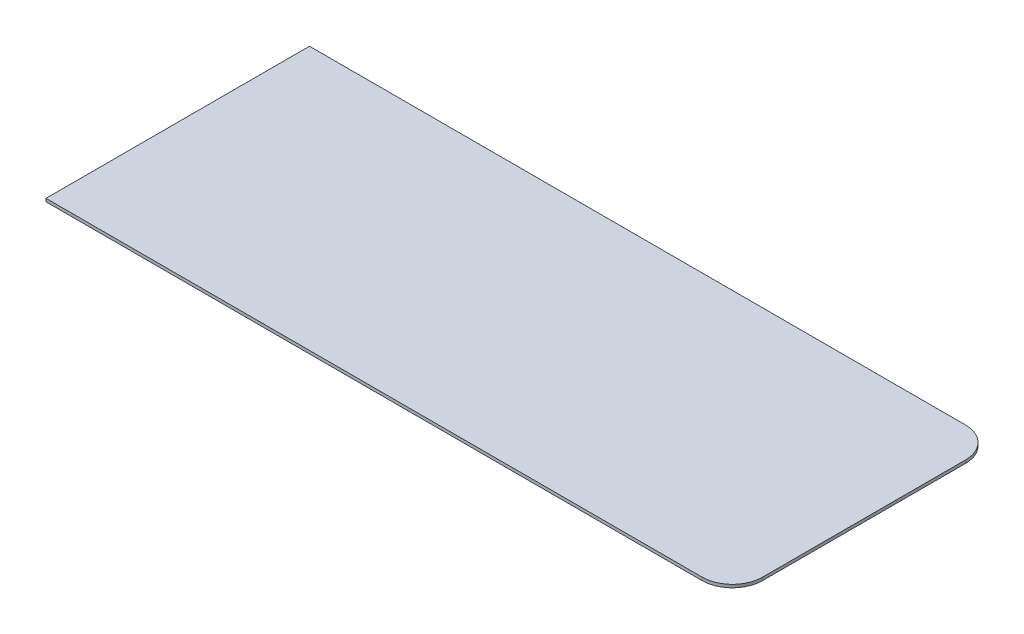
ISO-10303-21;
HEADER;
FILE_DESCRIPTION(('STEP AP214'),'2;1');
FILE_NAME('part.step','',(''),(''),'','','');
FILE_SCHEMA(('AUTOMOTIVE_DESIGN { 1 0 10303 214 1 1 1 1 }'));
ENDSEC;
DATA;
#1=APPLICATION_CONTEXT('core data for automotive mechanical design processes');
#2=APPLICATION_PROTOCOL_DEFINITION('international standard','automotive_design',2000,#1);
#3=PRODUCT_CONTEXT('',#1,'mechanical');
#4=PRODUCT('Part','Part','',(#3));
#5=PRODUCT_RELATED_PRODUCT_CATEGORY('part','',(#4));
#6=PRODUCT_DEFINITION_FORMATION('','',#4);
#7=PRODUCT_DEFINITION_CONTEXT('part definition',#1,'design');
#8=PRODUCT_DEFINITION('design','',#6,#7);
#9=PRODUCT_DEFINITION_SHAPE('','',#8);
#10=(LENGTH_UNIT() NAMED_UNIT(*) SI_UNIT(.MILLI.,.METRE.));
#11=(NAMED_UNIT(*) PLANE_ANGLE_UNIT() SI_UNIT($,.RADIAN.));
#12=(NAMED_UNIT(*) SI_UNIT($,.STERADIAN.) SOLID_ANGLE_UNIT());
#13=UNCERTAINTY_MEASURE_WITH_UNIT(LENGTH_MEASURE(1.E-05),#10,'distance_accuracy_value','');
#14=(GEOMETRIC_REPRESENTATION_CONTEXT(3) GLOBAL_UNCERTAINTY_ASSIGNED_CONTEXT((#13)) GLOBAL_UNIT_ASSIGNED_CONTEXT((#10,
#11,#12)) REPRESENTATION_CONTEXT('',''));
#15=CARTESIAN_POINT('',(0.,0.,0.));
#16=DIRECTION('',(0.,0.,1.));
#17=DIRECTION('',(1.,0.,0.));
#18=AXIS2_PLACEMENT_3D('',#15,#16,#17);
#19=CARTESIAN_POINT('',(2.36062020262803,0.,87.));
#20=DIRECTION('',(0.,0.,1.));
#21=DIRECTION('',(0.,1.,0.));
#22=AXIS2_PLACEMENT_3D('',#19,#20,#21);
#23=PLANE('',#22);
#24=DIRECTION('',(1.,0.,0.));
#25=VECTOR('',#24,1.);
#26=CARTESIAN_POINT('',(2.36062020262803,0.,87.));
#27=LINE('',#26,#25);
#28=CARTESIAN_POINT('',(-26.639379797372,-1.72956678816234E-13,87.));
#29=VERTEX_POINT('',#28);
#30=CARTESIAN_POINT('',(190.,0.,87.));
#31=VERTEX_POINT('',#30);
#32=EDGE_CURVE('E177',#29,#31,#27,.T.);
#33=ORIENTED_EDGE('',*,*,#32,.T.);
#34=DIRECTION('',(0.,-1.,0.));
#35=VECTOR('',#34,1.);
#36=CARTESIAN_POINT('',(190.,1.,87.));
#37=LINE('',#36,#35);
#38=CARTESIAN_POINT('',(190.,1.,87.));
#39=VERTEX_POINT('',#38);
#40=EDGE_CURVE('E153',#31,#39,#37,.F.);
#41=ORIENTED_EDGE('',*,*,#40,.T.);
#42=DIRECTION('',(-1.,0.,0.));
#43=VECTOR('',#42,1.);
#44=CARTESIAN_POINT('',(3.36062020262803,1.00000000000004,87.));
#45=LINE('',#44,#43);
#46=CARTESIAN_POINT('',(-26.639379797372,0.999999999999827,87.));
#47=VERTEX_POINT('',#46);
#48=EDGE_CURVE('E134',#47,#39,#45,.F.);
#49=ORIENTED_EDGE('',*,*,#48,.F.);
#50=DIRECTION('',(0.,1.,0.));
#51=VECTOR('',#50,1.);
#52=CARTESIAN_POINT('',(-26.639379797372,-1.72962440858082E-13,87.));
#53=LINE('',#52,#51);
#54=EDGE_CURVE('E13',#29,#47,#53,.T.);
#55=ORIENTED_EDGE('',*,*,#54,.F.);
#56=EDGE_LOOP('',(#33,#41,#49,#55));
#57=FACE_BOUND('',#56,.T.);
#58=ADVANCED_FACE('F63',(#57),#23,.T.);
#59=CARTESIAN_POINT('',(-26.639379797372,-1.68495527907442E-13,0.));
#60=DIRECTION('',(0.,0.,-1.));
#61=DIRECTION('',(0.,-1.,0.));
#62=AXIS2_PLACEMENT_3D('',#59,#60,#61);
#63=PLANE('',#62);
#64=DIRECTION('',(1.,0.,0.));
#65=VECTOR('',#64,1.);
#66=CARTESIAN_POINT('',(3.36062020262801,1.00000000000004,0.));
#67=LINE('',#66,#65);
#68=CARTESIAN_POINT('',(190.,1.,0.));
#69=VERTEX_POINT('',#68);
#70=CARTESIAN_POINT('',(-26.639379797372,0.999999999999832,0.));
#71=VERTEX_POINT('',#70);
#72=EDGE_CURVE('E67',#69,#71,#67,.F.);
#73=ORIENTED_EDGE('',*,*,#72,.F.);
#74=DIRECTION('',(0.,-1.,0.));
#75=VECTOR('',#74,1.);
#76=CARTESIAN_POINT('',(190.,1.,0.));
#77=LINE('',#76,#75);
#78=CARTESIAN_POINT('',(190.,0.,0.));
#79=VERTEX_POINT('',#78);
#80=EDGE_CURVE('E140',#69,#79,#77,.T.);
#81=ORIENTED_EDGE('',*,*,#80,.T.);
#82=DIRECTION('',(-1.,0.,0.));
#83=VECTOR('',#82,1.);
#84=CARTESIAN_POINT('',(-26.639379797372,-1.68495527907442E-13,0.));
#85=LINE('',#84,#83);
#86=CARTESIAN_POINT('',(-26.639379797372,-1.68510150838554E-13,0.));
#87=VERTEX_POINT('',#86);
#88=EDGE_CURVE('E127',#79,#87,#85,.T.);
#89=ORIENTED_EDGE('',*,*,#88,.T.);
#90=DIRECTION('',(0.,1.,0.));
#91=VECTOR('',#90,1.);
#92=CARTESIAN_POINT('',(-26.639379797372,-1.68495527907442E-13,0.));
#93=LINE('',#92,#91);
#94=EDGE_CURVE('E74',#87,#71,#93,.T.);
#95=ORIENTED_EDGE('',*,*,#94,.T.);
#96=EDGE_LOOP('',(#73,#81,#89,#95));
#97=FACE_BOUND('',#96,.T.);
#98=ADVANCED_FACE('F144',(#97),#63,.T.);
#99=CARTESIAN_POINT('',(0.,0.,0.));
#100=DIRECTION('',(0.,1.,0.));
#101=DIRECTION('',(0.,0.,1.));
#102=AXIS2_PLACEMENT_3D('',#99,#100,#101);
#103=PLANE('',#102);
#104=ORIENTED_EDGE('',*,*,#88,.F.);
#105=CARTESIAN_POINT('',(190.,0.,10.));
#106=DIRECTION('',(0.,1.,0.));
#107=DIRECTION('',(0.,0.,1.));
#108=AXIS2_PLACEMENT_3D('',#105,#106,#107);
#109=CIRCLE('',#108,10.);
#110=CARTESIAN_POINT('',(200.,0.,10.));
#111=VERTEX_POINT('',#110);
#112=EDGE_CURVE('E105',#79,#111,#109,.F.);
#113=ORIENTED_EDGE('',*,*,#112,.T.);
#114=DIRECTION('',(0.,0.,-1.));
#115=VECTOR('',#114,1.);
#116=CARTESIAN_POINT('',(200.,0.,0.));
#117=LINE('',#116,#115);
#118=CARTESIAN_POINT('',(200.,0.,77.));
#119=VERTEX_POINT('',#118);
#120=EDGE_CURVE('E168',#119,#111,#117,.T.);
#121=ORIENTED_EDGE('',*,*,#120,.F.);
#122=CARTESIAN_POINT('',(190.,0.,77.));
#123=DIRECTION('',(0.,1.,0.));
#124=DIRECTION('',(0.,0.,1.));
#125=AXIS2_PLACEMENT_3D('',#122,#123,#124);
#126=CIRCLE('',#125,10.);
#127=EDGE_CURVE('E142',#119,#31,#126,.F.);
#128=ORIENTED_EDGE('',*,*,#127,.T.);
#129=ORIENTED_EDGE('',*,*,#32,.F.);
#130=DIRECTION('',(0.,0.,1.));
#131=VECTOR('',#130,1.);
#132=CARTESIAN_POINT('',(-26.639379797372,-1.72962440858082E-13,87.));
#133=LINE('',#132,#131);
#134=EDGE_CURVE('E129',#87,#29,#133,.T.);
#135=ORIENTED_EDGE('',*,*,#134,.F.);
#136=EDGE_LOOP('',(#104,#113,#121,#128,#129,#135));
#137=FACE_BOUND('',#136,.T.);
#138=ADVANCED_FACE('F65',(#137),#103,.F.);
#139=CARTESIAN_POINT('',(3.36062020262801,1.00000000000004,0.));
#140=DIRECTION('',(0.,-1.,0.));
#141=DIRECTION('',(1.,0.,0.));
#142=AXIS2_PLACEMENT_3D('',#139,#140,#141);
#143=PLANE('',#142);
#144=ORIENTED_EDGE('',*,*,#48,.T.);
#145=CARTESIAN_POINT('',(190.,1.,77.));
#146=DIRECTION('',(0.,1.,0.));
#147=DIRECTION('',(0.,0.,1.));
#148=AXIS2_PLACEMENT_3D('',#145,#146,#147);
#149=CIRCLE('',#148,10.);
#150=CARTESIAN_POINT('',(200.,1.,77.));
#151=VERTEX_POINT('',#150);
#152=EDGE_CURVE('E163',#39,#151,#149,.T.);
#153=ORIENTED_EDGE('',*,*,#152,.T.);
#154=DIRECTION('',(0.,0.,-1.));
#155=VECTOR('',#154,1.);
#156=CARTESIAN_POINT('',(200.,1.,0.));
#157=LINE('',#156,#155);
#158=CARTESIAN_POINT('',(200.,1.,10.));
#159=VERTEX_POINT('',#158);
#160=EDGE_CURVE('E160',#151,#159,#157,.T.);
#161=ORIENTED_EDGE('',*,*,#160,.T.);
#162=CARTESIAN_POINT('',(190.,1.,10.));
#163=DIRECTION('',(0.,1.,0.));
#164=DIRECTION('',(0.,0.,1.));
#165=AXIS2_PLACEMENT_3D('',#162,#163,#164);
#166=CIRCLE('',#165,10.);
#167=EDGE_CURVE('E157',#159,#69,#166,.T.);
#168=ORIENTED_EDGE('',*,*,#167,.T.);
#169=ORIENTED_EDGE('',*,*,#72,.T.);
#170=DIRECTION('',(0.,0.,-1.));
#171=VECTOR('',#170,1.);
#172=CARTESIAN_POINT('',(-26.639379797372,0.999999999999832,0.));
#173=LINE('',#172,#171);
#174=EDGE_CURVE('E148',#71,#47,#173,.F.);
#175=ORIENTED_EDGE('',*,*,#174,.T.);
#176=EDGE_LOOP('',(#144,#153,#161,#168,#169,#175));
#177=FACE_BOUND('',#176,.T.);
#178=ADVANCED_FACE('F184',(#177),#143,.F.);
#179=CARTESIAN_POINT('',(-26.639379797372,-1.72962440858082E-13,87.));
#180=DIRECTION('',(-1.,0.,0.));
#181=DIRECTION('',(0.,-1.,0.));
#182=AXIS2_PLACEMENT_3D('',#179,#180,#181);
#183=PLANE('',#182);
#184=ORIENTED_EDGE('',*,*,#174,.F.);
#185=ORIENTED_EDGE('',*,*,#94,.F.);
#186=ORIENTED_EDGE('',*,*,#134,.T.);
#187=ORIENTED_EDGE('',*,*,#54,.T.);
#188=EDGE_LOOP('',(#184,#185,#186,#187));
#189=FACE_BOUND('',#188,.T.);
#190=ADVANCED_FACE('F198',(#189),#183,.T.);
#191=CARTESIAN_POINT('',(190.,1.,10.));
#192=DIRECTION('',(0.,-1.,0.));
#193=DIRECTION('',(0.,0.,-1.));
#194=AXIS2_PLACEMENT_3D('',#191,#192,#193);
#195=CYLINDRICAL_SURFACE('',#194,10.);
#196=ORIENTED_EDGE('',*,*,#167,.F.);
#197=DIRECTION('',(0.,-1.,0.));
#198=VECTOR('',#197,1.);
#199=CARTESIAN_POINT('',(200.,1.,10.));
#200=LINE('',#199,#198);
#201=EDGE_CURVE('E124',#111,#159,#200,.F.);
#202=ORIENTED_EDGE('',*,*,#201,.F.);
#203=ORIENTED_EDGE('',*,*,#112,.F.);
#204=ORIENTED_EDGE('',*,*,#80,.F.);
#205=EDGE_LOOP('',(#196,#202,#203,#204));
#206=FACE_BOUND('',#205,.T.);
#207=ADVANCED_FACE('F139',(#206),#195,.T.);
#208=CARTESIAN_POINT('',(200.,1.,0.));
#209=DIRECTION('',(-1.,0.,0.));
#210=DIRECTION('',(0.,0.,1.));
#211=AXIS2_PLACEMENT_3D('',#208,#209,#210);
#212=PLANE('',#211);
#213=ORIENTED_EDGE('',*,*,#160,.F.);
#214=DIRECTION('',(0.,-1.,0.));
#215=VECTOR('',#214,1.);
#216=CARTESIAN_POINT('',(200.,1.,77.));
#217=LINE('',#216,#215);
#218=EDGE_CURVE('E171',#151,#119,#217,.T.);
#219=ORIENTED_EDGE('',*,*,#218,.T.);
#220=ORIENTED_EDGE('',*,*,#120,.T.);
#221=ORIENTED_EDGE('',*,*,#201,.T.);
#222=EDGE_LOOP('',(#213,#219,#220,#221));
#223=FACE_BOUND('',#222,.T.);
#224=ADVANCED_FACE('F190',(#223),#212,.F.);
#225=CARTESIAN_POINT('',(190.,1.,77.));
#226=DIRECTION('',(0.,-1.,0.));
#227=DIRECTION('',(0.,0.,-1.));
#228=AXIS2_PLACEMENT_3D('',#225,#226,#227);
#229=CYLINDRICAL_SURFACE('',#228,10.);
#230=ORIENTED_EDGE('',*,*,#152,.F.);
#231=ORIENTED_EDGE('',*,*,#40,.F.);
#232=ORIENTED_EDGE('',*,*,#127,.F.);
#233=ORIENTED_EDGE('',*,*,#218,.F.);
#234=EDGE_LOOP('',(#230,#231,#232,#233));
#235=FACE_BOUND('',#234,.T.);
#236=ADVANCED_FACE('F189',(#235),#229,.T.);
#237=CLOSED_SHELL('',(#58,#98,#138,#178,#190,#207,#224,#236));
#238=MANIFOLD_SOLID_BREP('B2',#237);
#239=ADVANCED_BREP_SHAPE_REPRESENTATION('',(#18,#238),#14);
#240=SHAPE_DEFINITION_REPRESENTATION(#9,#239);
ENDSEC;
END-ISO-10303-21;
